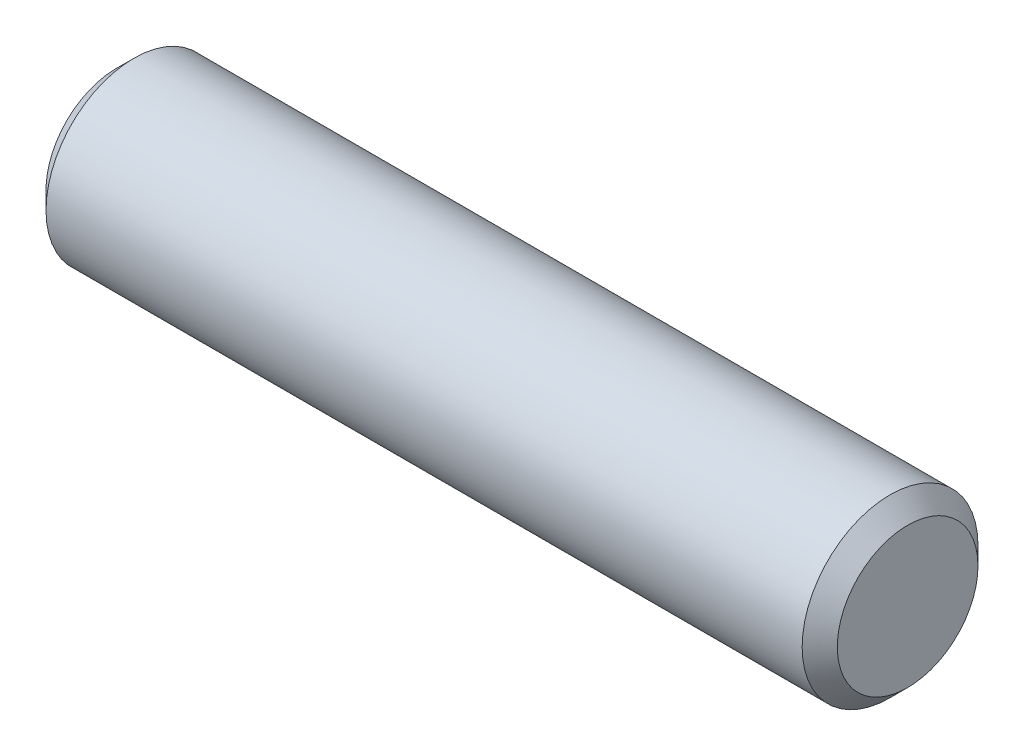
ISO-10303-21;
HEADER;
FILE_DESCRIPTION(('STEP AP214'),'2;1');
FILE_NAME('part.step','',(''),(''),'','','');
FILE_SCHEMA(('AUTOMOTIVE_DESIGN { 1 0 10303 214 1 1 1 1 }'));
ENDSEC;
DATA;
#1=APPLICATION_CONTEXT('core data for automotive mechanical design processes');
#2=APPLICATION_PROTOCOL_DEFINITION('international standard','automotive_design',2000,#1);
#3=PRODUCT_CONTEXT('',#1,'mechanical');
#4=PRODUCT('Part','Part','',(#3));
#5=PRODUCT_RELATED_PRODUCT_CATEGORY('part','',(#4));
#6=PRODUCT_DEFINITION_FORMATION('','',#4);
#7=PRODUCT_DEFINITION_CONTEXT('part definition',#1,'design');
#8=PRODUCT_DEFINITION('design','',#6,#7);
#9=PRODUCT_DEFINITION_SHAPE('','',#8);
#10=(LENGTH_UNIT() NAMED_UNIT(*) SI_UNIT(.MILLI.,.METRE.));
#11=(NAMED_UNIT(*) PLANE_ANGLE_UNIT() SI_UNIT($,.RADIAN.));
#12=(NAMED_UNIT(*) SI_UNIT($,.STERADIAN.) SOLID_ANGLE_UNIT());
#13=UNCERTAINTY_MEASURE_WITH_UNIT(LENGTH_MEASURE(1.E-05),#10,'distance_accuracy_value','');
#14=(GEOMETRIC_REPRESENTATION_CONTEXT(3) GLOBAL_UNCERTAINTY_ASSIGNED_CONTEXT((#13)) GLOBAL_UNIT_ASSIGNED_CONTEXT((#10,
#11,#12)) REPRESENTATION_CONTEXT('',''));
#15=CARTESIAN_POINT('',(0.,0.,0.));
#16=DIRECTION('',(0.,0.,1.));
#17=DIRECTION('',(1.,0.,0.));
#18=AXIS2_PLACEMENT_3D('',#15,#16,#17);
#19=CARTESIAN_POINT('',(-14.2875,0.,0.));
#20=DIRECTION('',(1.,0.,0.));
#21=DIRECTION('',(0.,0.,-1.));
#22=AXIS2_PLACEMENT_3D('',#19,#20,#21);
#23=CYLINDRICAL_SURFACE('',#22,3.175);
#24=CARTESIAN_POINT('',(13.6525,0.,0.));
#25=DIRECTION('',(1.,0.,0.));
#26=DIRECTION('',(0.,0.,-1.));
#27=AXIS2_PLACEMENT_3D('',#24,#25,#26);
#28=CIRCLE('',#27,3.175);
#29=CARTESIAN_POINT('',(13.6525,0.,-3.175));
#30=VERTEX_POINT('',#29);
#31=EDGE_CURVE('E39',#30,#30,#28,.F.);
#32=ORIENTED_EDGE('',*,*,#31,.T.);
#33=EDGE_LOOP('',(#32));
#34=FACE_BOUND('',#33,.T.);
#35=CARTESIAN_POINT('',(-13.6525,0.,0.));
#36=DIRECTION('',(1.,0.,0.));
#37=DIRECTION('',(0.,0.,-1.));
#38=AXIS2_PLACEMENT_3D('',#35,#36,#37);
#39=CIRCLE('',#38,3.175);
#40=CARTESIAN_POINT('',(-13.6525,0.,-3.175));
#41=VERTEX_POINT('',#40);
#42=EDGE_CURVE('E43',#41,#41,#39,.T.);
#43=ORIENTED_EDGE('',*,*,#42,.T.);
#44=EDGE_LOOP('',(#43));
#45=FACE_BOUND('',#44,.T.);
#46=ADVANCED_FACE('F32',(#34,#45),#23,.T.);
#47=CARTESIAN_POINT('',(-14.2875,0.,0.));
#48=DIRECTION('',(1.,0.,0.));
#49=DIRECTION('',(0.,0.,-1.));
#50=AXIS2_PLACEMENT_3D('',#47,#48,#49);
#51=PLANE('',#50);
#52=CARTESIAN_POINT('',(-14.2875,0.,0.));
#53=DIRECTION('',(1.,0.,0.));
#54=DIRECTION('',(0.,0.,-1.));
#55=AXIS2_PLACEMENT_3D('',#52,#53,#54);
#56=CIRCLE('',#55,2.54);
#57=CARTESIAN_POINT('',(-14.2875,0.,-2.54));
#58=VERTEX_POINT('',#57);
#59=EDGE_CURVE('E10',#58,#58,#56,.F.);
#60=ORIENTED_EDGE('',*,*,#59,.T.);
#61=EDGE_LOOP('',(#60));
#62=FACE_BOUND('',#61,.T.);
#63=ADVANCED_FACE('F63',(#62),#51,.F.);
#64=CARTESIAN_POINT('',(14.2875,0.,0.));
#65=DIRECTION('',(1.,0.,0.));
#66=DIRECTION('',(0.,0.,-1.));
#67=AXIS2_PLACEMENT_3D('',#64,#65,#66);
#68=PLANE('',#67);
#69=CARTESIAN_POINT('',(14.2875,0.,0.));
#70=DIRECTION('',(1.,0.,0.));
#71=DIRECTION('',(0.,0.,-1.));
#72=AXIS2_PLACEMENT_3D('',#69,#70,#71);
#73=CIRCLE('',#72,2.54);
#74=CARTESIAN_POINT('',(14.2875,0.,-2.54));
#75=VERTEX_POINT('',#74);
#76=EDGE_CURVE('E47',#75,#75,#73,.T.);
#77=ORIENTED_EDGE('',*,*,#76,.T.);
#78=EDGE_LOOP('',(#77));
#79=FACE_BOUND('',#78,.T.);
#80=ADVANCED_FACE('F53',(#79),#68,.T.);
#81=CARTESIAN_POINT('',(14.2875,0.,0.));
#82=DIRECTION('',(-1.,0.,0.));
#83=DIRECTION('',(0.,0.,1.));
#84=AXIS2_PLACEMENT_3D('',#81,#82,#83);
#85=CONICAL_SURFACE('',#84,2.54,0.785398163397445);
#86=ORIENTED_EDGE('',*,*,#31,.F.);
#87=EDGE_LOOP('',(#86));
#88=FACE_BOUND('',#87,.T.);
#89=ORIENTED_EDGE('',*,*,#76,.F.);
#90=EDGE_LOOP('',(#89));
#91=FACE_BOUND('',#90,.T.);
#92=ADVANCED_FACE('F55',(#88,#91),#85,.T.);
#93=CARTESIAN_POINT('',(-13.6525,0.,0.));
#94=DIRECTION('',(1.,0.,0.));
#95=DIRECTION('',(0.,0.,-1.));
#96=AXIS2_PLACEMENT_3D('',#93,#94,#95);
#97=CONICAL_SURFACE('',#96,3.175,0.78539816339745);
#98=ORIENTED_EDGE('',*,*,#59,.F.);
#99=EDGE_LOOP('',(#98));
#100=FACE_BOUND('',#99,.T.);
#101=ORIENTED_EDGE('',*,*,#42,.F.);
#102=EDGE_LOOP('',(#101));
#103=FACE_BOUND('',#102,.T.);
#104=ADVANCED_FACE('F34',(#100,#103),#97,.T.);
#105=CLOSED_SHELL('',(#46,#63,#80,#92,#104));
#106=MANIFOLD_SOLID_BREP('B2',#105);
#107=ADVANCED_BREP_SHAPE_REPRESENTATION('',(#18,#106),#14);
#108=SHAPE_DEFINITION_REPRESENTATION(#9,#107);
ENDSEC;
END-ISO-10303-21;
